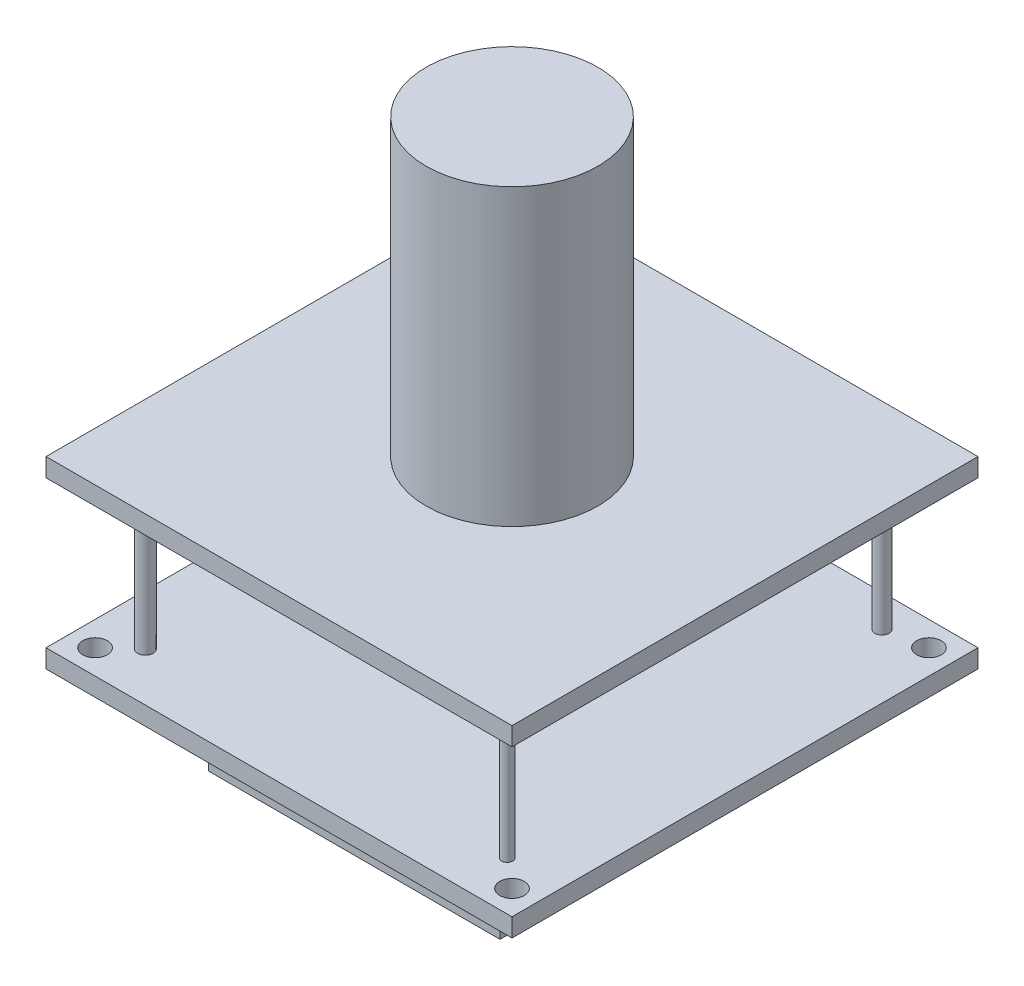
ISO-10303-21;
HEADER;
FILE_DESCRIPTION(('STEP AP214'),'2;1');
FILE_NAME('part.step','',(''),(''),'','','');
FILE_SCHEMA(('AUTOMOTIVE_DESIGN { 1 0 10303 214 1 1 1 1 }'));
ENDSEC;
DATA;
#1=APPLICATION_CONTEXT('core data for automotive mechanical design processes');
#2=APPLICATION_PROTOCOL_DEFINITION('international standard','automotive_design',2000,#1);
#3=PRODUCT_CONTEXT('',#1,'mechanical');
#4=PRODUCT('Part','Part','',(#3));
#5=PRODUCT_RELATED_PRODUCT_CATEGORY('part','',(#4));
#6=PRODUCT_DEFINITION_FORMATION('','',#4);
#7=PRODUCT_DEFINITION_CONTEXT('part definition',#1,'design');
#8=PRODUCT_DEFINITION('design','',#6,#7);
#9=PRODUCT_DEFINITION_SHAPE('','',#8);
#10=(LENGTH_UNIT() NAMED_UNIT(*) SI_UNIT(.MILLI.,.METRE.));
#11=(NAMED_UNIT(*) PLANE_ANGLE_UNIT() SI_UNIT($,.RADIAN.));
#12=(NAMED_UNIT(*) SI_UNIT($,.STERADIAN.) SOLID_ANGLE_UNIT());
#13=UNCERTAINTY_MEASURE_WITH_UNIT(LENGTH_MEASURE(1.E-05),#10,'distance_accuracy_value','');
#14=(GEOMETRIC_REPRESENTATION_CONTEXT(3) GLOBAL_UNCERTAINTY_ASSIGNED_CONTEXT((#13)) GLOBAL_UNIT_ASSIGNED_CONTEXT((#10,
#11,#12)) REPRESENTATION_CONTEXT('',''));
#15=CARTESIAN_POINT('',(0.,0.,0.));
#16=DIRECTION('',(0.,0.,1.));
#17=DIRECTION('',(1.,0.,0.));
#18=AXIS2_PLACEMENT_3D('',#15,#16,#17);
#19=CARTESIAN_POINT('',(0.,0.,0.));
#20=DIRECTION('',(0.,1.,0.));
#21=DIRECTION('',(0.,0.,1.));
#22=AXIS2_PLACEMENT_3D('',#19,#20,#21);
#23=PLANE('',#22);
#24=DIRECTION('',(0.,0.,-1.));
#25=VECTOR('',#24,1.);
#26=CARTESIAN_POINT('',(7.22103364409154,0.,31.9841501722467));
#27=LINE('',#26,#25);
#28=CARTESIAN_POINT('',(7.22103364409154,0.,31.9841501722467));
#29=VERTEX_POINT('',#28);
#30=CARTESIAN_POINT('',(7.22103364409154,0.,7.15281569222345));
#31=VERTEX_POINT('',#30);
#32=EDGE_CURVE('E59',#29,#31,#27,.T.);
#33=ORIENTED_EDGE('',*,*,#32,.F.);
#34=DIRECTION('',(-1.,0.,0.));
#35=VECTOR('',#34,1.);
#36=CARTESIAN_POINT('',(7.22103364409154,0.,31.9841501722467));
#37=LINE('',#36,#35);
#38=CARTESIAN_POINT('',(31.0063595288024,0.,31.9841501722467));
#39=VERTEX_POINT('',#38);
#40=EDGE_CURVE('E181',#39,#29,#37,.T.);
#41=ORIENTED_EDGE('',*,*,#40,.F.);
#42=DIRECTION('',(0.,0.,1.));
#43=VECTOR('',#42,1.);
#44=CARTESIAN_POINT('',(31.0063595288024,0.,31.9841501722467));
#45=LINE('',#44,#43);
#46=CARTESIAN_POINT('',(31.0063595288024,0.,7.15281569222345));
#47=VERTEX_POINT('',#46);
#48=EDGE_CURVE('E190',#47,#39,#45,.T.);
#49=ORIENTED_EDGE('',*,*,#48,.F.);
#50=DIRECTION('',(1.,0.,0.));
#51=VECTOR('',#50,1.);
#52=CARTESIAN_POINT('',(7.22103364409154,0.,7.15281569222345));
#53=LINE('',#52,#51);
#54=EDGE_CURVE('E171',#31,#47,#53,.T.);
#55=ORIENTED_EDGE('',*,*,#54,.F.);
#56=EDGE_LOOP('',(#33,#41,#49,#55));
#57=FACE_BOUND('',#56,.T.);
#58=CARTESIAN_POINT('',(2.,0.,2.));
#59=DIRECTION('',(0.,1.,0.));
#60=DIRECTION('',(0.,0.,1.));
#61=AXIS2_PLACEMENT_3D('',#58,#59,#60);
#62=CIRCLE('',#61,1.);
#63=CARTESIAN_POINT('',(2.,0.,3.));
#64=VERTEX_POINT('',#63);
#65=EDGE_CURVE('E278',#64,#64,#62,.T.);
#66=ORIENTED_EDGE('',*,*,#65,.T.);
#67=EDGE_LOOP('',(#66));
#68=FACE_BOUND('',#67,.T.);
#69=CARTESIAN_POINT('',(36.,0.,2.));
#70=DIRECTION('',(0.,1.,0.));
#71=DIRECTION('',(0.,0.,1.));
#72=AXIS2_PLACEMENT_3D('',#69,#70,#71);
#73=CIRCLE('',#72,0.999999999999998);
#74=CARTESIAN_POINT('',(36.,0.,3.));
#75=VERTEX_POINT('',#74);
#76=EDGE_CURVE('E272',#75,#75,#73,.T.);
#77=ORIENTED_EDGE('',*,*,#76,.T.);
#78=EDGE_LOOP('',(#77));
#79=FACE_BOUND('',#78,.T.);
#80=CARTESIAN_POINT('',(36.0000000000004,0.,36.));
#81=DIRECTION('',(0.,1.,0.));
#82=DIRECTION('',(0.,0.,1.));
#83=AXIS2_PLACEMENT_3D('',#80,#81,#82);
#84=CIRCLE('',#83,0.999999999999998);
#85=CARTESIAN_POINT('',(36.0000000000004,0.,37.));
#86=VERTEX_POINT('',#85);
#87=EDGE_CURVE('E266',#86,#86,#84,.T.);
#88=ORIENTED_EDGE('',*,*,#87,.T.);
#89=EDGE_LOOP('',(#88));
#90=FACE_BOUND('',#89,.T.);
#91=CARTESIAN_POINT('',(2.00000000000035,0.,36.));
#92=DIRECTION('',(0.,1.,0.));
#93=DIRECTION('',(0.,0.,1.));
#94=AXIS2_PLACEMENT_3D('',#91,#92,#93);
#95=CIRCLE('',#94,1.);
#96=CARTESIAN_POINT('',(2.00000000000035,0.,37.));
#97=VERTEX_POINT('',#96);
#98=EDGE_CURVE('E260',#97,#97,#95,.T.);
#99=ORIENTED_EDGE('',*,*,#98,.T.);
#100=EDGE_LOOP('',(#99));
#101=FACE_BOUND('',#100,.T.);
#102=DIRECTION('',(0.,0.,-1.));
#103=VECTOR('',#102,1.);
#104=CARTESIAN_POINT('',(15.179794695381,0.,0.));
#105=LINE('',#104,#103);
#106=CARTESIAN_POINT('',(15.179794695381,0.,1.92277271566178));
#107=VERTEX_POINT('',#106);
#108=CARTESIAN_POINT('',(15.179794695381,0.,0.));
#109=VERTEX_POINT('',#108);
#110=EDGE_CURVE('E51',#107,#109,#105,.T.);
#111=ORIENTED_EDGE('',*,*,#110,.F.);
#112=DIRECTION('',(-1.,0.,0.));
#113=VECTOR('',#112,1.);
#114=CARTESIAN_POINT('',(15.179794695381,0.,1.92277271566178));
#115=LINE('',#114,#113);
#116=CARTESIAN_POINT('',(22.4563762279886,0.,1.92277271566178));
#117=VERTEX_POINT('',#116);
#118=EDGE_CURVE('E167',#117,#107,#115,.T.);
#119=ORIENTED_EDGE('',*,*,#118,.F.);
#120=DIRECTION('',(0.,0.,1.));
#121=VECTOR('',#120,1.);
#122=CARTESIAN_POINT('',(22.4563762279886,0.,0.));
#123=LINE('',#122,#121);
#124=CARTESIAN_POINT('',(22.4563762279886,0.,0.));
#125=VERTEX_POINT('',#124);
#126=EDGE_CURVE('E652',#125,#117,#123,.T.);
#127=ORIENTED_EDGE('',*,*,#126,.F.);
#128=DIRECTION('',(-1.,0.,0.));
#129=VECTOR('',#128,1.);
#130=CARTESIAN_POINT('',(0.,0.,0.));
#131=LINE('',#130,#129);
#132=CARTESIAN_POINT('',(38.,0.,0.));
#133=VERTEX_POINT('',#132);
#134=EDGE_CURVE('E291',#133,#125,#131,.T.);
#135=ORIENTED_EDGE('',*,*,#134,.F.);
#136=DIRECTION('',(0.,0.,-1.));
#137=VECTOR('',#136,1.);
#138=CARTESIAN_POINT('',(38.,0.,0.));
#139=LINE('',#138,#137);
#140=CARTESIAN_POINT('',(38.,0.,38.));
#141=VERTEX_POINT('',#140);
#142=EDGE_CURVE('E302',#141,#133,#139,.T.);
#143=ORIENTED_EDGE('',*,*,#142,.F.);
#144=DIRECTION('',(1.,0.,0.));
#145=VECTOR('',#144,1.);
#146=CARTESIAN_POINT('',(0.,0.,38.));
#147=LINE('',#146,#145);
#148=CARTESIAN_POINT('',(0.,0.,38.));
#149=VERTEX_POINT('',#148);
#150=EDGE_CURVE('E300',#149,#141,#147,.T.);
#151=ORIENTED_EDGE('',*,*,#150,.F.);
#152=DIRECTION('',(0.,0.,1.));
#153=VECTOR('',#152,1.);
#154=CARTESIAN_POINT('',(0.,0.,0.));
#155=LINE('',#154,#153);
#156=CARTESIAN_POINT('',(0.,0.,0.));
#157=VERTEX_POINT('',#156);
#158=EDGE_CURVE('E284',#157,#149,#155,.T.);
#159=ORIENTED_EDGE('',*,*,#158,.F.);
#160=EDGE_CURVE('E304',#109,#157,#131,.T.);
#161=ORIENTED_EDGE('',*,*,#160,.F.);
#162=EDGE_LOOP('',(#111,#119,#127,#135,#143,#151,#159,#161));
#163=FACE_BOUND('',#162,.T.);
#164=ADVANCED_FACE('F35',(#57,#68,#79,#90,#101,#163),#23,.F.);
#165=CARTESIAN_POINT('',(0.,1.5,0.));
#166=DIRECTION('',(0.,1.,0.));
#167=DIRECTION('',(0.,0.,1.));
#168=AXIS2_PLACEMENT_3D('',#165,#166,#167);
#169=PLANE('',#168);
#170=CARTESIAN_POINT('',(33.6441203343727,1.5,34.0306887282925));
#171=DIRECTION('',(0.,1.,0.));
#172=DIRECTION('',(0.,0.,1.));
#173=AXIS2_PLACEMENT_3D('',#170,#171,#172);
#174=CIRCLE('',#173,0.454786345787979);
#175=CARTESIAN_POINT('',(33.6441203343727,1.5,34.4854750740804));
#176=VERTEX_POINT('',#175);
#177=EDGE_CURVE('E238',#176,#176,#174,.T.);
#178=ORIENTED_EDGE('',*,*,#177,.F.);
#179=EDGE_LOOP('',(#178));
#180=FACE_BOUND('',#179,.T.);
#181=CARTESIAN_POINT('',(32.7800262773755,1.5,2.61182597514517));
#182=DIRECTION('',(0.,1.,0.));
#183=DIRECTION('',(0.,0.,1.));
#184=AXIS2_PLACEMENT_3D('',#181,#182,#183);
#185=CIRCLE('',#184,0.577059181286836);
#186=CARTESIAN_POINT('',(32.7800262773755,1.5,3.188885156432));
#187=VERTEX_POINT('',#186);
#188=EDGE_CURVE('E242',#187,#187,#185,.T.);
#189=ORIENTED_EDGE('',*,*,#188,.F.);
#190=EDGE_LOOP('',(#189));
#191=FACE_BOUND('',#190,.T.);
#192=CARTESIAN_POINT('',(4.76518737683649,1.5,3.05973858013158));
#193=DIRECTION('',(0.,1.,0.));
#194=DIRECTION('',(0.,0.,1.));
#195=AXIS2_PLACEMENT_3D('',#192,#193,#194);
#196=CIRCLE('',#195,0.447912604986419);
#197=CARTESIAN_POINT('',(4.76518737683649,1.5,3.507651185118));
#198=VERTEX_POINT('',#197);
#199=EDGE_CURVE('E248',#198,#198,#196,.T.);
#200=ORIENTED_EDGE('',*,*,#199,.F.);
#201=EDGE_LOOP('',(#200));
#202=FACE_BOUND('',#201,.T.);
#203=CARTESIAN_POINT('',(4.12848649273333,1.5,34.0306887282925));
#204=DIRECTION('',(0.,1.,0.));
#205=DIRECTION('',(0.,0.,1.));
#206=AXIS2_PLACEMENT_3D('',#203,#204,#205);
#207=CIRCLE('',#206,0.636700884103156);
#208=CARTESIAN_POINT('',(4.12848649273333,1.5,34.6673896123956));
#209=VERTEX_POINT('',#208);
#210=EDGE_CURVE('E254',#209,#209,#207,.T.);
#211=ORIENTED_EDGE('',*,*,#210,.F.);
#212=EDGE_LOOP('',(#211));
#213=FACE_BOUND('',#212,.T.);
#214=CARTESIAN_POINT('',(36.0000000000004,1.5,36.));
#215=DIRECTION('',(0.,1.,0.));
#216=DIRECTION('',(0.,0.,1.));
#217=AXIS2_PLACEMENT_3D('',#214,#215,#216);
#218=CIRCLE('',#217,0.999999999999998);
#219=CARTESIAN_POINT('',(36.0000000000004,1.5,37.));
#220=VERTEX_POINT('',#219);
#221=EDGE_CURVE('E269',#220,#220,#218,.T.);
#222=ORIENTED_EDGE('',*,*,#221,.F.);
#223=EDGE_LOOP('',(#222));
#224=FACE_BOUND('',#223,.T.);
#225=CARTESIAN_POINT('',(2.,1.5,2.));
#226=DIRECTION('',(0.,1.,0.));
#227=DIRECTION('',(0.,0.,1.));
#228=AXIS2_PLACEMENT_3D('',#225,#226,#227);
#229=CIRCLE('',#228,1.);
#230=CARTESIAN_POINT('',(2.,1.5,3.));
#231=VERTEX_POINT('',#230);
#232=EDGE_CURVE('E281',#231,#231,#229,.T.);
#233=ORIENTED_EDGE('',*,*,#232,.F.);
#234=EDGE_LOOP('',(#233));
#235=FACE_BOUND('',#234,.T.);
#236=DIRECTION('',(0.,0.,1.));
#237=VECTOR('',#236,1.);
#238=CARTESIAN_POINT('',(0.,1.5,0.));
#239=LINE('',#238,#237);
#240=CARTESIAN_POINT('',(0.,1.5,0.));
#241=VERTEX_POINT('',#240);
#242=CARTESIAN_POINT('',(0.,1.5,38.));
#243=VERTEX_POINT('',#242);
#244=EDGE_CURVE('E287',#241,#243,#239,.T.);
#245=ORIENTED_EDGE('',*,*,#244,.T.);
#246=DIRECTION('',(1.,0.,0.));
#247=VECTOR('',#246,1.);
#248=CARTESIAN_POINT('',(0.,1.5,38.));
#249=LINE('',#248,#247);
#250=CARTESIAN_POINT('',(38.,1.5,38.));
#251=VERTEX_POINT('',#250);
#252=EDGE_CURVE('E290',#243,#251,#249,.T.);
#253=ORIENTED_EDGE('',*,*,#252,.T.);
#254=DIRECTION('',(0.,0.,-1.));
#255=VECTOR('',#254,1.);
#256=CARTESIAN_POINT('',(38.,1.5,0.));
#257=LINE('',#256,#255);
#258=CARTESIAN_POINT('',(38.,1.5,0.));
#259=VERTEX_POINT('',#258);
#260=EDGE_CURVE('E293',#251,#259,#257,.T.);
#261=ORIENTED_EDGE('',*,*,#260,.T.);
#262=DIRECTION('',(-1.,0.,0.));
#263=VECTOR('',#262,1.);
#264=CARTESIAN_POINT('',(0.,1.5,0.));
#265=LINE('',#264,#263);
#266=EDGE_CURVE('E295',#259,#241,#265,.T.);
#267=ORIENTED_EDGE('',*,*,#266,.T.);
#268=EDGE_LOOP('',(#245,#253,#261,#267));
#269=FACE_BOUND('',#268,.T.);
#270=CARTESIAN_POINT('',(36.,1.5,2.));
#271=DIRECTION('',(0.,1.,0.));
#272=DIRECTION('',(0.,0.,1.));
#273=AXIS2_PLACEMENT_3D('',#270,#271,#272);
#274=CIRCLE('',#273,0.999999999999998);
#275=CARTESIAN_POINT('',(36.,1.5,3.));
#276=VERTEX_POINT('',#275);
#277=EDGE_CURVE('E275',#276,#276,#274,.T.);
#278=ORIENTED_EDGE('',*,*,#277,.F.);
#279=EDGE_LOOP('',(#278));
#280=FACE_BOUND('',#279,.T.);
#281=CARTESIAN_POINT('',(2.00000000000035,1.5,36.));
#282=DIRECTION('',(0.,1.,0.));
#283=DIRECTION('',(0.,0.,1.));
#284=AXIS2_PLACEMENT_3D('',#281,#282,#283);
#285=CIRCLE('',#284,1.);
#286=CARTESIAN_POINT('',(2.00000000000035,1.5,37.));
#287=VERTEX_POINT('',#286);
#288=EDGE_CURVE('E263',#287,#287,#285,.T.);
#289=ORIENTED_EDGE('',*,*,#288,.F.);
#290=EDGE_LOOP('',(#289));
#291=FACE_BOUND('',#290,.T.);
#292=ADVANCED_FACE('F331',(#180,#191,#202,#213,#224,#235,#269,#280,#291),#169,.T.);
#293=CARTESIAN_POINT('',(0.,1.5,0.));
#294=DIRECTION('',(1.,0.,0.));
#295=DIRECTION('',(0.,0.,-1.));
#296=AXIS2_PLACEMENT_3D('',#293,#294,#295);
#297=PLANE('',#296);
#298=ORIENTED_EDGE('',*,*,#158,.T.);
#299=DIRECTION('',(0.,-1.,0.));
#300=VECTOR('',#299,1.);
#301=CARTESIAN_POINT('',(0.,1.5,38.));
#302=LINE('',#301,#300);
#303=EDGE_CURVE('E39',#243,#149,#302,.T.);
#304=ORIENTED_EDGE('',*,*,#303,.F.);
#305=ORIENTED_EDGE('',*,*,#244,.F.);
#306=DIRECTION('',(0.,-1.,0.));
#307=VECTOR('',#306,1.);
#308=CARTESIAN_POINT('',(0.,1.5,0.));
#309=LINE('',#308,#307);
#310=EDGE_CURVE('E297',#241,#157,#309,.T.);
#311=ORIENTED_EDGE('',*,*,#310,.T.);
#312=EDGE_LOOP('',(#298,#304,#305,#311));
#313=FACE_BOUND('',#312,.T.);
#314=ADVANCED_FACE('F37',(#313),#297,.F.);
#315=CARTESIAN_POINT('',(0.,1.5,38.));
#316=DIRECTION('',(0.,0.,-1.));
#317=DIRECTION('',(-1.,0.,0.));
#318=AXIS2_PLACEMENT_3D('',#315,#316,#317);
#319=PLANE('',#318);
#320=ORIENTED_EDGE('',*,*,#150,.T.);
#321=DIRECTION('',(0.,-1.,0.));
#322=VECTOR('',#321,1.);
#323=CARTESIAN_POINT('',(38.,1.5,38.));
#324=LINE('',#323,#322);
#325=EDGE_CURVE('E310',#251,#141,#324,.T.);
#326=ORIENTED_EDGE('',*,*,#325,.F.);
#327=ORIENTED_EDGE('',*,*,#252,.F.);
#328=ORIENTED_EDGE('',*,*,#303,.T.);
#329=EDGE_LOOP('',(#320,#326,#327,#328));
#330=FACE_BOUND('',#329,.T.);
#331=ADVANCED_FACE('F319',(#330),#319,.F.);
#332=CARTESIAN_POINT('',(38.,1.5,0.));
#333=DIRECTION('',(-1.,0.,0.));
#334=DIRECTION('',(0.,0.,1.));
#335=AXIS2_PLACEMENT_3D('',#332,#333,#334);
#336=PLANE('',#335);
#337=ORIENTED_EDGE('',*,*,#142,.T.);
#338=DIRECTION('',(0.,-1.,0.));
#339=VECTOR('',#338,1.);
#340=CARTESIAN_POINT('',(38.,1.5,0.));
#341=LINE('',#340,#339);
#342=EDGE_CURVE('E308',#259,#133,#341,.T.);
#343=ORIENTED_EDGE('',*,*,#342,.F.);
#344=ORIENTED_EDGE('',*,*,#260,.F.);
#345=ORIENTED_EDGE('',*,*,#325,.T.);
#346=EDGE_LOOP('',(#337,#343,#344,#345));
#347=FACE_BOUND('',#346,.T.);
#348=ADVANCED_FACE('F328',(#347),#336,.F.);
#349=CARTESIAN_POINT('',(0.,1.5,0.));
#350=DIRECTION('',(0.,0.,1.));
#351=DIRECTION('',(1.,0.,0.));
#352=AXIS2_PLACEMENT_3D('',#349,#350,#351);
#353=PLANE('',#352);
#354=ORIENTED_EDGE('',*,*,#134,.T.);
#355=DIRECTION('',(0.,1.,0.));
#356=VECTOR('',#355,1.);
#357=CARTESIAN_POINT('',(22.4563762279886,-6.6,0.));
#358=LINE('',#357,#356);
#359=CARTESIAN_POINT('',(22.4563762279886,-6.6,0.));
#360=VERTEX_POINT('',#359);
#361=EDGE_CURVE('E156',#360,#125,#358,.T.);
#362=ORIENTED_EDGE('',*,*,#361,.F.);
#363=DIRECTION('',(1.,0.,0.));
#364=VECTOR('',#363,1.);
#365=CARTESIAN_POINT('',(15.179794695381,-6.6,0.));
#366=LINE('',#365,#364);
#367=CARTESIAN_POINT('',(15.179794695381,-6.6,0.));
#368=VERTEX_POINT('',#367);
#369=EDGE_CURVE('E150',#368,#360,#366,.T.);
#370=ORIENTED_EDGE('',*,*,#369,.F.);
#371=DIRECTION('',(0.,1.,0.));
#372=VECTOR('',#371,1.);
#373=CARTESIAN_POINT('',(15.179794695381,-6.6,0.));
#374=LINE('',#373,#372);
#375=EDGE_CURVE('E154',#368,#109,#374,.T.);
#376=ORIENTED_EDGE('',*,*,#375,.T.);
#377=ORIENTED_EDGE('',*,*,#160,.T.);
#378=ORIENTED_EDGE('',*,*,#310,.F.);
#379=ORIENTED_EDGE('',*,*,#266,.F.);
#380=ORIENTED_EDGE('',*,*,#342,.T.);
#381=EDGE_LOOP('',(#354,#362,#370,#376,#377,#378,#379,#380));
#382=FACE_BOUND('',#381,.T.);
#383=ADVANCED_FACE('F153',(#382),#353,.F.);
#384=CARTESIAN_POINT('',(2.,1.5,2.));
#385=DIRECTION('',(0.,-1.,0.));
#386=DIRECTION('',(0.,0.,-1.));
#387=AXIS2_PLACEMENT_3D('',#384,#385,#386);
#388=CYLINDRICAL_SURFACE('',#387,1.);
#389=ORIENTED_EDGE('',*,*,#232,.T.);
#390=EDGE_LOOP('',(#389));
#391=FACE_BOUND('',#390,.T.);
#392=ORIENTED_EDGE('',*,*,#65,.F.);
#393=EDGE_LOOP('',(#392));
#394=FACE_BOUND('',#393,.T.);
#395=ADVANCED_FACE('F357',(#391,#394),#388,.F.);
#396=CARTESIAN_POINT('',(36.,1.5,2.));
#397=DIRECTION('',(0.,-1.,0.));
#398=DIRECTION('',(0.,0.,-1.));
#399=AXIS2_PLACEMENT_3D('',#396,#397,#398);
#400=CYLINDRICAL_SURFACE('',#399,0.999999999999998);
#401=ORIENTED_EDGE('',*,*,#277,.T.);
#402=EDGE_LOOP('',(#401));
#403=FACE_BOUND('',#402,.T.);
#404=ORIENTED_EDGE('',*,*,#76,.F.);
#405=EDGE_LOOP('',(#404));
#406=FACE_BOUND('',#405,.T.);
#407=ADVANCED_FACE('F597',(#403,#406),#400,.F.);
#408=CARTESIAN_POINT('',(36.0000000000004,1.5,36.));
#409=DIRECTION('',(0.,-1.,0.));
#410=DIRECTION('',(0.,0.,-1.));
#411=AXIS2_PLACEMENT_3D('',#408,#409,#410);
#412=CYLINDRICAL_SURFACE('',#411,0.999999999999998);
#413=ORIENTED_EDGE('',*,*,#221,.T.);
#414=EDGE_LOOP('',(#413));
#415=FACE_BOUND('',#414,.T.);
#416=ORIENTED_EDGE('',*,*,#87,.F.);
#417=EDGE_LOOP('',(#416));
#418=FACE_BOUND('',#417,.T.);
#419=ADVANCED_FACE('F344',(#415,#418),#412,.F.);
#420=CARTESIAN_POINT('',(2.00000000000035,1.5,36.));
#421=DIRECTION('',(0.,-1.,0.));
#422=DIRECTION('',(0.,0.,-1.));
#423=AXIS2_PLACEMENT_3D('',#420,#421,#422);
#424=CYLINDRICAL_SURFACE('',#423,1.);
#425=ORIENTED_EDGE('',*,*,#288,.T.);
#426=EDGE_LOOP('',(#425));
#427=FACE_BOUND('',#426,.T.);
#428=ORIENTED_EDGE('',*,*,#98,.F.);
#429=EDGE_LOOP('',(#428));
#430=FACE_BOUND('',#429,.T.);
#431=ADVANCED_FACE('F340',(#427,#430),#424,.F.);
#432=CARTESIAN_POINT('',(4.12848649273333,13.5,34.0306887282925));
#433=DIRECTION('',(0.,-1.,0.));
#434=DIRECTION('',(0.,0.,-1.));
#435=AXIS2_PLACEMENT_3D('',#432,#433,#434);
#436=CYLINDRICAL_SURFACE('',#435,0.636700884103156);
#437=CARTESIAN_POINT('',(4.12848649273333,13.5,34.0306887282925));
#438=DIRECTION('',(0.,1.,0.));
#439=DIRECTION('',(0.,0.,1.));
#440=AXIS2_PLACEMENT_3D('',#437,#438,#439);
#441=CIRCLE('',#440,0.636700884103156);
#442=CARTESIAN_POINT('',(4.12848649273333,13.5,34.6673896123956));
#443=VERTEX_POINT('',#442);
#444=EDGE_CURVE('E257',#443,#443,#441,.T.);
#445=ORIENTED_EDGE('',*,*,#444,.F.);
#446=EDGE_LOOP('',(#445));
#447=FACE_BOUND('',#446,.T.);
#448=ORIENTED_EDGE('',*,*,#210,.T.);
#449=EDGE_LOOP('',(#448));
#450=FACE_BOUND('',#449,.T.);
#451=ADVANCED_FACE('F343',(#447,#450),#436,.T.);
#452=CARTESIAN_POINT('',(4.76518737683649,13.5,3.05973858013158));
#453=DIRECTION('',(0.,-1.,0.));
#454=DIRECTION('',(0.,0.,-1.));
#455=AXIS2_PLACEMENT_3D('',#452,#453,#454);
#456=CYLINDRICAL_SURFACE('',#455,0.447912604986419);
#457=CARTESIAN_POINT('',(4.76518737683649,13.5,3.05973858013158));
#458=DIRECTION('',(0.,1.,0.));
#459=DIRECTION('',(0.,0.,1.));
#460=AXIS2_PLACEMENT_3D('',#457,#458,#459);
#461=CIRCLE('',#460,0.447912604986419);
#462=CARTESIAN_POINT('',(4.76518737683649,13.5,3.507651185118));
#463=VERTEX_POINT('',#462);
#464=EDGE_CURVE('E251',#463,#463,#461,.T.);
#465=ORIENTED_EDGE('',*,*,#464,.F.);
#466=EDGE_LOOP('',(#465));
#467=FACE_BOUND('',#466,.T.);
#468=ORIENTED_EDGE('',*,*,#199,.T.);
#469=EDGE_LOOP('',(#468));
#470=FACE_BOUND('',#469,.T.);
#471=ADVANCED_FACE('F382',(#467,#470),#456,.T.);
#472=CARTESIAN_POINT('',(32.7800262773755,13.5,2.61182597514517));
#473=DIRECTION('',(0.,-1.,0.));
#474=DIRECTION('',(0.,0.,-1.));
#475=AXIS2_PLACEMENT_3D('',#472,#473,#474);
#476=CYLINDRICAL_SURFACE('',#475,0.577059181286836);
#477=CARTESIAN_POINT('',(32.7800262773755,13.5,2.61182597514517));
#478=DIRECTION('',(0.,1.,0.));
#479=DIRECTION('',(0.,0.,1.));
#480=AXIS2_PLACEMENT_3D('',#477,#478,#479);
#481=CIRCLE('',#480,0.577059181286836);
#482=CARTESIAN_POINT('',(32.7800262773755,13.5,3.188885156432));
#483=VERTEX_POINT('',#482);
#484=EDGE_CURVE('E245',#483,#483,#481,.T.);
#485=ORIENTED_EDGE('',*,*,#484,.F.);
#486=EDGE_LOOP('',(#485));
#487=FACE_BOUND('',#486,.T.);
#488=ORIENTED_EDGE('',*,*,#188,.T.);
#489=EDGE_LOOP('',(#488));
#490=FACE_BOUND('',#489,.T.);
#491=ADVANCED_FACE('F392',(#487,#490),#476,.T.);
#492=CARTESIAN_POINT('',(33.6441203343727,13.5,34.0306887282925));
#493=DIRECTION('',(0.,-1.,0.));
#494=DIRECTION('',(0.,0.,-1.));
#495=AXIS2_PLACEMENT_3D('',#492,#493,#494);
#496=CYLINDRICAL_SURFACE('',#495,0.454786345787979);
#497=CARTESIAN_POINT('',(33.6441203343727,13.5,34.0306887282925));
#498=DIRECTION('',(0.,1.,0.));
#499=DIRECTION('',(0.,0.,1.));
#500=AXIS2_PLACEMENT_3D('',#497,#498,#499);
#501=CIRCLE('',#500,0.454786345787979);
#502=CARTESIAN_POINT('',(33.6441203343727,13.5,34.4854750740804));
#503=VERTEX_POINT('',#502);
#504=EDGE_CURVE('E239',#503,#503,#501,.T.);
#505=ORIENTED_EDGE('',*,*,#504,.F.);
#506=EDGE_LOOP('',(#505));
#507=FACE_BOUND('',#506,.T.);
#508=ORIENTED_EDGE('',*,*,#177,.T.);
#509=EDGE_LOOP('',(#508));
#510=FACE_BOUND('',#509,.T.);
#511=ADVANCED_FACE('F402',(#507,#510),#496,.T.);
#512=CARTESIAN_POINT('',(0.,15.,0.));
#513=DIRECTION('',(1.,0.,0.));
#514=DIRECTION('',(0.,0.,-1.));
#515=AXIS2_PLACEMENT_3D('',#512,#513,#514);
#516=PLANE('',#515);
#517=DIRECTION('',(0.,0.,1.));
#518=VECTOR('',#517,1.);
#519=CARTESIAN_POINT('',(0.,13.5,0.));
#520=LINE('',#519,#518);
#521=CARTESIAN_POINT('',(0.,13.5,0.));
#522=VERTEX_POINT('',#521);
#523=CARTESIAN_POINT('',(0.,13.5,38.));
#524=VERTEX_POINT('',#523);
#525=EDGE_CURVE('E207',#522,#524,#520,.T.);
#526=ORIENTED_EDGE('',*,*,#525,.T.);
#527=DIRECTION('',(0.,-1.,0.));
#528=VECTOR('',#527,1.);
#529=CARTESIAN_POINT('',(0.,15.,38.));
#530=LINE('',#529,#528);
#531=CARTESIAN_POINT('',(0.,15.,38.));
#532=VERTEX_POINT('',#531);
#533=EDGE_CURVE('E235',#532,#524,#530,.T.);
#534=ORIENTED_EDGE('',*,*,#533,.F.);
#535=DIRECTION('',(0.,0.,1.));
#536=VECTOR('',#535,1.);
#537=CARTESIAN_POINT('',(0.,15.,0.));
#538=LINE('',#537,#536);
#539=CARTESIAN_POINT('',(0.,15.,0.));
#540=VERTEX_POINT('',#539);
#541=EDGE_CURVE('E209',#540,#532,#538,.T.);
#542=ORIENTED_EDGE('',*,*,#541,.F.);
#543=DIRECTION('',(0.,-1.,0.));
#544=VECTOR('',#543,1.);
#545=CARTESIAN_POINT('',(0.,15.,0.));
#546=LINE('',#545,#544);
#547=EDGE_CURVE('E219',#540,#522,#546,.T.);
#548=ORIENTED_EDGE('',*,*,#547,.T.);
#549=EDGE_LOOP('',(#526,#534,#542,#548));
#550=FACE_BOUND('',#549,.T.);
#551=ADVANCED_FACE('F412',(#550),#516,.F.);
#552=CARTESIAN_POINT('',(0.,15.,38.));
#553=DIRECTION('',(0.,0.,-1.));
#554=DIRECTION('',(-1.,0.,0.));
#555=AXIS2_PLACEMENT_3D('',#552,#553,#554);
#556=PLANE('',#555);
#557=DIRECTION('',(1.,0.,0.));
#558=VECTOR('',#557,1.);
#559=CARTESIAN_POINT('',(0.,13.5,38.));
#560=LINE('',#559,#558);
#561=CARTESIAN_POINT('',(38.,13.5,38.));
#562=VERTEX_POINT('',#561);
#563=EDGE_CURVE('E222',#524,#562,#560,.T.);
#564=ORIENTED_EDGE('',*,*,#563,.T.);
#565=DIRECTION('',(0.,-1.,0.));
#566=VECTOR('',#565,1.);
#567=CARTESIAN_POINT('',(38.,15.,38.));
#568=LINE('',#567,#566);
#569=CARTESIAN_POINT('',(38.,15.,38.));
#570=VERTEX_POINT('',#569);
#571=EDGE_CURVE('E232',#570,#562,#568,.T.);
#572=ORIENTED_EDGE('',*,*,#571,.F.);
#573=DIRECTION('',(1.,0.,0.));
#574=VECTOR('',#573,1.);
#575=CARTESIAN_POINT('',(0.,15.,38.));
#576=LINE('',#575,#574);
#577=EDGE_CURVE('E212',#532,#570,#576,.T.);
#578=ORIENTED_EDGE('',*,*,#577,.F.);
#579=ORIENTED_EDGE('',*,*,#533,.T.);
#580=EDGE_LOOP('',(#564,#572,#578,#579));
#581=FACE_BOUND('',#580,.T.);
#582=ADVANCED_FACE('F422',(#581),#556,.F.);
#583=CARTESIAN_POINT('',(38.,15.,0.));
#584=DIRECTION('',(-1.,0.,0.));
#585=DIRECTION('',(0.,0.,1.));
#586=AXIS2_PLACEMENT_3D('',#583,#584,#585);
#587=PLANE('',#586);
#588=DIRECTION('',(0.,0.,-1.));
#589=VECTOR('',#588,1.);
#590=CARTESIAN_POINT('',(38.,13.5,0.));
#591=LINE('',#590,#589);
#592=CARTESIAN_POINT('',(38.,13.5,0.));
#593=VERTEX_POINT('',#592);
#594=EDGE_CURVE('E224',#562,#593,#591,.T.);
#595=ORIENTED_EDGE('',*,*,#594,.T.);
#596=DIRECTION('',(0.,-1.,0.));
#597=VECTOR('',#596,1.);
#598=CARTESIAN_POINT('',(38.,15.,0.));
#599=LINE('',#598,#597);
#600=CARTESIAN_POINT('',(38.,15.,0.));
#601=VERTEX_POINT('',#600);
#602=EDGE_CURVE('E229',#601,#593,#599,.T.);
#603=ORIENTED_EDGE('',*,*,#602,.F.);
#604=DIRECTION('',(0.,0.,-1.));
#605=VECTOR('',#604,1.);
#606=CARTESIAN_POINT('',(38.,15.,0.));
#607=LINE('',#606,#605);
#608=EDGE_CURVE('E215',#570,#601,#607,.T.);
#609=ORIENTED_EDGE('',*,*,#608,.F.);
#610=ORIENTED_EDGE('',*,*,#571,.T.);
#611=EDGE_LOOP('',(#595,#603,#609,#610));
#612=FACE_BOUND('',#611,.T.);
#613=ADVANCED_FACE('F432',(#612),#587,.F.);
#614=CARTESIAN_POINT('',(0.,15.,0.));
#615=DIRECTION('',(0.,0.,1.));
#616=DIRECTION('',(1.,0.,0.));
#617=AXIS2_PLACEMENT_3D('',#614,#615,#616);
#618=PLANE('',#617);
#619=DIRECTION('',(-1.,0.,0.));
#620=VECTOR('',#619,1.);
#621=CARTESIAN_POINT('',(0.,13.5,0.));
#622=LINE('',#621,#620);
#623=EDGE_CURVE('E213',#593,#522,#622,.T.);
#624=ORIENTED_EDGE('',*,*,#623,.T.);
#625=ORIENTED_EDGE('',*,*,#547,.F.);
#626=DIRECTION('',(-1.,0.,0.));
#627=VECTOR('',#626,1.);
#628=CARTESIAN_POINT('',(0.,15.,0.));
#629=LINE('',#628,#627);
#630=EDGE_CURVE('E217',#601,#540,#629,.T.);
#631=ORIENTED_EDGE('',*,*,#630,.F.);
#632=ORIENTED_EDGE('',*,*,#602,.T.);
#633=EDGE_LOOP('',(#624,#625,#631,#632));
#634=FACE_BOUND('',#633,.T.);
#635=ADVANCED_FACE('F442',(#634),#618,.F.);
#636=CARTESIAN_POINT('',(0.,15.,0.));
#637=DIRECTION('',(0.,1.,0.));
#638=DIRECTION('',(0.,0.,1.));
#639=AXIS2_PLACEMENT_3D('',#636,#637,#638);
#640=PLANE('',#639);
#641=CARTESIAN_POINT('',(19.,15.,19.));
#642=DIRECTION('',(0.,1.,0.));
#643=DIRECTION('',(0.,0.,1.));
#644=AXIS2_PLACEMENT_3D('',#641,#642,#643);
#645=CIRCLE('',#644,7.);
#646=CARTESIAN_POINT('',(19.,15.,26.));
#647=VERTEX_POINT('',#646);
#648=EDGE_CURVE('E11',#647,#647,#645,.T.);
#649=ORIENTED_EDGE('',*,*,#648,.F.);
#650=EDGE_LOOP('',(#649));
#651=FACE_BOUND('',#650,.T.);
#652=ORIENTED_EDGE('',*,*,#541,.T.);
#653=ORIENTED_EDGE('',*,*,#577,.T.);
#654=ORIENTED_EDGE('',*,*,#608,.T.);
#655=ORIENTED_EDGE('',*,*,#630,.T.);
#656=EDGE_LOOP('',(#652,#653,#654,#655));
#657=FACE_BOUND('',#656,.T.);
#658=ADVANCED_FACE('F452',(#651,#657),#640,.T.);
#659=CARTESIAN_POINT('',(0.,13.5,0.));
#660=DIRECTION('',(0.,1.,0.));
#661=DIRECTION('',(0.,0.,1.));
#662=AXIS2_PLACEMENT_3D('',#659,#660,#661);
#663=PLANE('',#662);
#664=ORIENTED_EDGE('',*,*,#444,.T.);
#665=EDGE_LOOP('',(#664));
#666=FACE_BOUND('',#665,.T.);
#667=ORIENTED_EDGE('',*,*,#464,.T.);
#668=EDGE_LOOP('',(#667));
#669=FACE_BOUND('',#668,.T.);
#670=ORIENTED_EDGE('',*,*,#484,.T.);
#671=EDGE_LOOP('',(#670));
#672=FACE_BOUND('',#671,.T.);
#673=ORIENTED_EDGE('',*,*,#504,.T.);
#674=EDGE_LOOP('',(#673));
#675=FACE_BOUND('',#674,.T.);
#676=ORIENTED_EDGE('',*,*,#525,.F.);
#677=ORIENTED_EDGE('',*,*,#623,.F.);
#678=ORIENTED_EDGE('',*,*,#594,.F.);
#679=ORIENTED_EDGE('',*,*,#563,.F.);
#680=EDGE_LOOP('',(#676,#677,#678,#679));
#681=FACE_BOUND('',#680,.T.);
#682=ADVANCED_FACE('F460',(#666,#669,#672,#675,#681),#663,.F.);
#683=CARTESIAN_POINT('',(19.,39.,19.));
#684=DIRECTION('',(0.,-1.,0.));
#685=DIRECTION('',(0.,0.,-1.));
#686=AXIS2_PLACEMENT_3D('',#683,#684,#685);
#687=CYLINDRICAL_SURFACE('',#686,7.);
#688=CARTESIAN_POINT('',(19.,39.,19.));
#689=DIRECTION('',(0.,1.,0.));
#690=DIRECTION('',(0.,0.,1.));
#691=AXIS2_PLACEMENT_3D('',#688,#689,#690);
#692=CIRCLE('',#691,7.);
#693=CARTESIAN_POINT('',(19.,39.,26.));
#694=VERTEX_POINT('',#693);
#695=EDGE_CURVE('E205',#694,#694,#692,.T.);
#696=ORIENTED_EDGE('',*,*,#695,.F.);
#697=EDGE_LOOP('',(#696));
#698=FACE_BOUND('',#697,.T.);
#699=ORIENTED_EDGE('',*,*,#648,.T.);
#700=EDGE_LOOP('',(#699));
#701=FACE_BOUND('',#700,.T.);
#702=ADVANCED_FACE('F465',(#698,#701),#687,.T.);
#703=CARTESIAN_POINT('',(19.,39.,19.));
#704=DIRECTION('',(0.,1.,0.));
#705=DIRECTION('',(0.,0.,1.));
#706=AXIS2_PLACEMENT_3D('',#703,#704,#705);
#707=PLANE('',#706);
#708=ORIENTED_EDGE('',*,*,#695,.T.);
#709=EDGE_LOOP('',(#708));
#710=FACE_BOUND('',#709,.T.);
#711=ADVANCED_FACE('F482',(#710),#707,.T.);
#712=CARTESIAN_POINT('',(7.22103364409154,-6.6,31.9841501722467));
#713=DIRECTION('',(1.,0.,0.));
#714=DIRECTION('',(0.,0.,-1.));
#715=AXIS2_PLACEMENT_3D('',#712,#713,#714);
#716=PLANE('',#715);
#717=ORIENTED_EDGE('',*,*,#32,.T.);
#718=DIRECTION('',(0.,1.,0.));
#719=VECTOR('',#718,1.);
#720=CARTESIAN_POINT('',(7.22103364409154,-6.6,7.15281569222345));
#721=LINE('',#720,#719);
#722=CARTESIAN_POINT('',(7.22103364409154,-6.6,7.15281569222345));
#723=VERTEX_POINT('',#722);
#724=EDGE_CURVE('E202',#723,#31,#721,.T.);
#725=ORIENTED_EDGE('',*,*,#724,.F.);
#726=DIRECTION('',(0.,0.,-1.));
#727=VECTOR('',#726,1.);
#728=CARTESIAN_POINT('',(7.22103364409154,-6.6,31.9841501722467));
#729=LINE('',#728,#727);
#730=CARTESIAN_POINT('',(7.22103364409154,-6.6,31.9841501722467));
#731=VERTEX_POINT('',#730);
#732=EDGE_CURVE('E177',#731,#723,#729,.T.);
#733=ORIENTED_EDGE('',*,*,#732,.F.);
#734=DIRECTION('',(0.,1.,0.));
#735=VECTOR('',#734,1.);
#736=CARTESIAN_POINT('',(7.22103364409154,-6.6,31.9841501722467));
#737=LINE('',#736,#735);
#738=EDGE_CURVE('E186',#731,#29,#737,.T.);
#739=ORIENTED_EDGE('',*,*,#738,.T.);
#740=EDGE_LOOP('',(#717,#725,#733,#739));
#741=FACE_BOUND('',#740,.T.);
#742=ADVANCED_FACE('F491',(#741),#716,.F.);
#743=CARTESIAN_POINT('',(7.22103364409154,-6.6,7.15281569222345));
#744=DIRECTION('',(0.,0.,1.));
#745=DIRECTION('',(1.,0.,0.));
#746=AXIS2_PLACEMENT_3D('',#743,#744,#745);
#747=PLANE('',#746);
#748=ORIENTED_EDGE('',*,*,#54,.T.);
#749=DIRECTION('',(0.,1.,0.));
#750=VECTOR('',#749,1.);
#751=CARTESIAN_POINT('',(31.0063595288024,-6.6,7.15281569222345));
#752=LINE('',#751,#750);
#753=CARTESIAN_POINT('',(31.0063595288024,-6.6,7.15281569222345));
#754=VERTEX_POINT('',#753);
#755=EDGE_CURVE('E199',#754,#47,#752,.T.);
#756=ORIENTED_EDGE('',*,*,#755,.F.);
#757=DIRECTION('',(1.,0.,0.));
#758=VECTOR('',#757,1.);
#759=CARTESIAN_POINT('',(7.22103364409154,-6.6,7.15281569222345));
#760=LINE('',#759,#758);
#761=EDGE_CURVE('E180',#723,#754,#760,.T.);
#762=ORIENTED_EDGE('',*,*,#761,.F.);
#763=ORIENTED_EDGE('',*,*,#724,.T.);
#764=EDGE_LOOP('',(#748,#756,#762,#763));
#765=FACE_BOUND('',#764,.T.);
#766=ADVANCED_FACE('F514',(#765),#747,.F.);
#767=CARTESIAN_POINT('',(31.0063595288024,-6.6,31.9841501722467));
#768=DIRECTION('',(-1.,0.,0.));
#769=DIRECTION('',(0.,0.,1.));
#770=AXIS2_PLACEMENT_3D('',#767,#768,#769);
#771=PLANE('',#770);
#772=ORIENTED_EDGE('',*,*,#48,.T.);
#773=DIRECTION('',(0.,1.,0.));
#774=VECTOR('',#773,1.);
#775=CARTESIAN_POINT('',(31.0063595288024,-6.6,31.9841501722467));
#776=LINE('',#775,#774);
#777=CARTESIAN_POINT('',(31.0063595288024,-6.6,31.9841501722467));
#778=VERTEX_POINT('',#777);
#779=EDGE_CURVE('E196',#778,#39,#776,.T.);
#780=ORIENTED_EDGE('',*,*,#779,.F.);
#781=DIRECTION('',(0.,0.,1.));
#782=VECTOR('',#781,1.);
#783=CARTESIAN_POINT('',(31.0063595288024,-6.6,31.9841501722467));
#784=LINE('',#783,#782);
#785=EDGE_CURVE('E183',#754,#778,#784,.T.);
#786=ORIENTED_EDGE('',*,*,#785,.F.);
#787=ORIENTED_EDGE('',*,*,#755,.T.);
#788=EDGE_LOOP('',(#772,#780,#786,#787));
#789=FACE_BOUND('',#788,.T.);
#790=ADVANCED_FACE('F524',(#789),#771,.F.);
#791=CARTESIAN_POINT('',(7.22103364409154,-6.6,31.9841501722467));
#792=DIRECTION('',(0.,0.,-1.));
#793=DIRECTION('',(-1.,0.,0.));
#794=AXIS2_PLACEMENT_3D('',#791,#792,#793);
#795=PLANE('',#794);
#796=ORIENTED_EDGE('',*,*,#40,.T.);
#797=ORIENTED_EDGE('',*,*,#738,.F.);
#798=DIRECTION('',(-1.,0.,0.));
#799=VECTOR('',#798,1.);
#800=CARTESIAN_POINT('',(7.22103364409154,-6.6,31.9841501722467));
#801=LINE('',#800,#799);
#802=EDGE_CURVE('E185',#778,#731,#801,.T.);
#803=ORIENTED_EDGE('',*,*,#802,.F.);
#804=ORIENTED_EDGE('',*,*,#779,.T.);
#805=EDGE_LOOP('',(#796,#797,#803,#804));
#806=FACE_BOUND('',#805,.T.);
#807=ADVANCED_FACE('F534',(#806),#795,.F.);
#808=CARTESIAN_POINT('',(0.,-6.6,0.));
#809=DIRECTION('',(0.,-1.,0.));
#810=DIRECTION('',(0.,0.,-1.));
#811=AXIS2_PLACEMENT_3D('',#808,#809,#810);
#812=PLANE('',#811);
#813=ORIENTED_EDGE('',*,*,#732,.T.);
#814=ORIENTED_EDGE('',*,*,#761,.T.);
#815=ORIENTED_EDGE('',*,*,#785,.T.);
#816=ORIENTED_EDGE('',*,*,#802,.T.);
#817=EDGE_LOOP('',(#813,#814,#815,#816));
#818=FACE_BOUND('',#817,.T.);
#819=ADVANCED_FACE('F544',(#818),#812,.T.);
#820=CARTESIAN_POINT('',(15.179794695381,-6.6,0.));
#821=DIRECTION('',(1.,0.,0.));
#822=DIRECTION('',(0.,0.,-1.));
#823=AXIS2_PLACEMENT_3D('',#820,#821,#822);
#824=PLANE('',#823);
#825=ORIENTED_EDGE('',*,*,#110,.T.);
#826=ORIENTED_EDGE('',*,*,#375,.F.);
#827=DIRECTION('',(0.,0.,-1.));
#828=VECTOR('',#827,1.);
#829=CARTESIAN_POINT('',(15.179794695381,-6.6,0.));
#830=LINE('',#829,#828);
#831=CARTESIAN_POINT('',(15.179794695381,-6.6,1.92277271566178));
#832=VERTEX_POINT('',#831);
#833=EDGE_CURVE('E160',#832,#368,#830,.T.);
#834=ORIENTED_EDGE('',*,*,#833,.F.);
#835=DIRECTION('',(0.,1.,0.));
#836=VECTOR('',#835,1.);
#837=CARTESIAN_POINT('',(15.179794695381,-6.6,1.92277271566178));
#838=LINE('',#837,#836);
#839=EDGE_CURVE('E650',#832,#107,#838,.T.);
#840=ORIENTED_EDGE('',*,*,#839,.T.);
#841=EDGE_LOOP('',(#825,#826,#834,#840));
#842=FACE_BOUND('',#841,.T.);
#843=ADVANCED_FACE('F169',(#842),#824,.F.);
#844=CARTESIAN_POINT('',(22.4563762279886,-6.6,0.));
#845=DIRECTION('',(-1.,0.,0.));
#846=DIRECTION('',(0.,0.,1.));
#847=AXIS2_PLACEMENT_3D('',#844,#845,#846);
#848=PLANE('',#847);
#849=ORIENTED_EDGE('',*,*,#126,.T.);
#850=DIRECTION('',(0.,1.,0.));
#851=VECTOR('',#850,1.);
#852=CARTESIAN_POINT('',(22.4563762279886,-6.6,1.92277271566178));
#853=LINE('',#852,#851);
#854=CARTESIAN_POINT('',(22.4563762279886,-6.6,1.92277271566178));
#855=VERTEX_POINT('',#854);
#856=EDGE_CURVE('E173',#855,#117,#853,.T.);
#857=ORIENTED_EDGE('',*,*,#856,.F.);
#858=DIRECTION('',(0.,0.,1.));
#859=VECTOR('',#858,1.);
#860=CARTESIAN_POINT('',(22.4563762279886,-6.6,0.));
#861=LINE('',#860,#859);
#862=EDGE_CURVE('E159',#360,#855,#861,.T.);
#863=ORIENTED_EDGE('',*,*,#862,.F.);
#864=ORIENTED_EDGE('',*,*,#361,.T.);
#865=EDGE_LOOP('',(#849,#857,#863,#864));
#866=FACE_BOUND('',#865,.T.);
#867=ADVANCED_FACE('F563',(#866),#848,.F.);
#868=CARTESIAN_POINT('',(15.179794695381,-6.6,1.92277271566178));
#869=DIRECTION('',(0.,0.,-1.));
#870=DIRECTION('',(-1.,0.,0.));
#871=AXIS2_PLACEMENT_3D('',#868,#869,#870);
#872=PLANE('',#871);
#873=ORIENTED_EDGE('',*,*,#118,.T.);
#874=ORIENTED_EDGE('',*,*,#839,.F.);
#875=DIRECTION('',(-1.,0.,0.));
#876=VECTOR('',#875,1.);
#877=CARTESIAN_POINT('',(15.179794695381,-6.6,1.92277271566178));
#878=LINE('',#877,#876);
#879=EDGE_CURVE('E165',#855,#832,#878,.T.);
#880=ORIENTED_EDGE('',*,*,#879,.F.);
#881=ORIENTED_EDGE('',*,*,#856,.T.);
#882=EDGE_LOOP('',(#873,#874,#880,#881));
#883=FACE_BOUND('',#882,.T.);
#884=ADVANCED_FACE('F572',(#883),#872,.F.);
#885=CARTESIAN_POINT('',(0.,-6.6,0.));
#886=DIRECTION('',(0.,1.,0.));
#887=DIRECTION('',(0.,0.,1.));
#888=AXIS2_PLACEMENT_3D('',#885,#886,#887);
#889=PLANE('',#888);
#890=ORIENTED_EDGE('',*,*,#833,.T.);
#891=ORIENTED_EDGE('',*,*,#369,.T.);
#892=ORIENTED_EDGE('',*,*,#862,.T.);
#893=ORIENTED_EDGE('',*,*,#879,.T.);
#894=EDGE_LOOP('',(#890,#891,#892,#893));
#895=FACE_BOUND('',#894,.T.);
#896=ADVANCED_FACE('F163',(#895),#889,.F.);
#897=CLOSED_SHELL('',(#164,#292,#314,#331,#348,#383,#395,#407,#419,#431,#451,#471,#491,#511,
#551,#582,#613,#635,#658,#682,#702,#711,#742,#766,#790,#807,#819,#843,#867,#884,#896));
#898=MANIFOLD_SOLID_BREP('B2',#897);
#899=ADVANCED_BREP_SHAPE_REPRESENTATION('',(#18,#898),#14);
#900=SHAPE_DEFINITION_REPRESENTATION(#9,#899);
ENDSEC;
END-ISO-10303-21;
